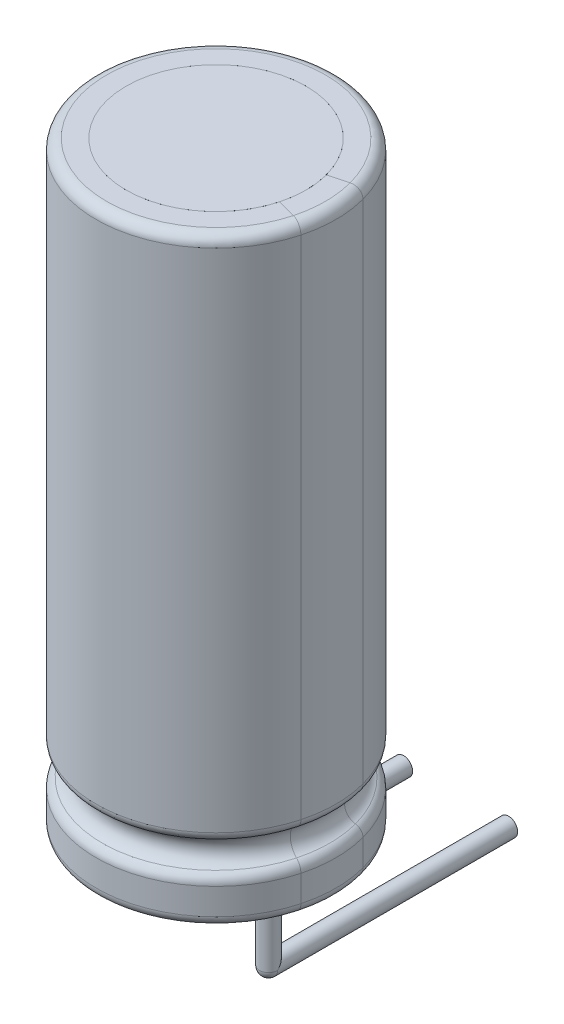
ISO-10303-21;
HEADER;
FILE_DESCRIPTION(('STEP AP214'),'2;1');
FILE_NAME('part.step','',(''),(''),'','','');
FILE_SCHEMA(('AUTOMOTIVE_DESIGN { 1 0 10303 214 1 1 1 1 }'));
ENDSEC;
DATA;
#1=APPLICATION_CONTEXT('core data for automotive mechanical design processes');
#2=APPLICATION_PROTOCOL_DEFINITION('international standard','automotive_design',2000,#1);
#3=PRODUCT_CONTEXT('',#1,'mechanical');
#4=PRODUCT('Part','Part','',(#3));
#5=PRODUCT_RELATED_PRODUCT_CATEGORY('part','',(#4));
#6=PRODUCT_DEFINITION_FORMATION('','',#4);
#7=PRODUCT_DEFINITION_CONTEXT('part definition',#1,'design');
#8=PRODUCT_DEFINITION('design','',#6,#7);
#9=PRODUCT_DEFINITION_SHAPE('','',#8);
#10=(LENGTH_UNIT() NAMED_UNIT(*) SI_UNIT(.MILLI.,.METRE.));
#11=(NAMED_UNIT(*) PLANE_ANGLE_UNIT() SI_UNIT($,.RADIAN.));
#12=(NAMED_UNIT(*) SI_UNIT($,.STERADIAN.) SOLID_ANGLE_UNIT());
#13=UNCERTAINTY_MEASURE_WITH_UNIT(LENGTH_MEASURE(1.E-05),#10,'distance_accuracy_value','');
#14=(GEOMETRIC_REPRESENTATION_CONTEXT(3) GLOBAL_UNCERTAINTY_ASSIGNED_CONTEXT((#13)) GLOBAL_UNIT_ASSIGNED_CONTEXT((#10,
#11,#12)) REPRESENTATION_CONTEXT('',''));
#15=CARTESIAN_POINT('',(0.,0.,0.));
#16=DIRECTION('',(0.,0.,1.));
#17=DIRECTION('',(1.,0.,0.));
#18=AXIS2_PLACEMENT_3D('',#15,#16,#17);
#19=CARTESIAN_POINT('',(-1.75,-3.,0.));
#20=DIRECTION('',(0.,1.,0.));
#21=DIRECTION('',(0.,0.,1.));
#22=AXIS2_PLACEMENT_3D('',#19,#20,#21);
#23=CYLINDRICAL_SURFACE('',#22,0.301076539545515);
#24=CARTESIAN_POINT('',(-1.75,-3.,0.));
#25=DIRECTION('',(0.,-1.,0.));
#26=DIRECTION('',(0.,0.,-1.));
#27=AXIS2_PLACEMENT_3D('',#24,#25,#26);
#28=CIRCLE('',#27,0.301076539545515);
#29=CARTESIAN_POINT('',(-1.44892346045448,-3.,0.));
#30=VERTEX_POINT('',#29);
#31=CARTESIAN_POINT('',(-2.05107653954552,-3.,0.));
#32=VERTEX_POINT('',#31);
#33=EDGE_CURVE('E51',#30,#32,#28,.T.);
#34=ORIENTED_EDGE('',*,*,#33,.F.);
#35=CARTESIAN_POINT('',(-1.75,-3.,0.));
#36=DIRECTION('',(0.,0.707106781186547,0.707106781186547));
#37=DIRECTION('',(0.,0.707106781186547,-0.707106781186547));
#38=AXIS2_PLACEMENT_3D('',#35,#36,#37);
#39=ELLIPSE('',#38,0.425786525537627,0.301076539545515);
#40=EDGE_CURVE('E61',#30,#32,#39,.T.);
#41=ORIENTED_EDGE('',*,*,#40,.T.);
#42=EDGE_LOOP('',(#34,#41));
#43=FACE_BOUND('',#42,.T.);
#44=CARTESIAN_POINT('',(-1.75,0.,0.));
#45=DIRECTION('',(0.,-1.,0.));
#46=DIRECTION('',(0.,0.,-1.));
#47=AXIS2_PLACEMENT_3D('',#44,#45,#46);
#48=CIRCLE('',#47,0.301076539545515);
#49=CARTESIAN_POINT('',(-1.75,0.,-0.301076539545515));
#50=VERTEX_POINT('',#49);
#51=EDGE_CURVE('E12',#50,#50,#48,.T.);
#52=ORIENTED_EDGE('',*,*,#51,.T.);
#53=EDGE_LOOP('',(#52));
#54=FACE_BOUND('',#53,.T.);
#55=ADVANCED_FACE('F47',(#43,#54),#23,.T.);
#56=CARTESIAN_POINT('',(-1.75,0.,0.));
#57=DIRECTION('',(0.,-1.,0.));
#58=DIRECTION('',(0.,0.,-1.));
#59=AXIS2_PLACEMENT_3D('',#56,#57,#58);
#60=PLANE('',#59);
#61=ORIENTED_EDGE('',*,*,#51,.F.);
#62=EDGE_LOOP('',(#61));
#63=FACE_BOUND('',#62,.T.);
#64=ADVANCED_FACE('F49',(#63),#60,.F.);
#65=CARTESIAN_POINT('',(-1.75,-3.,-8.));
#66=DIRECTION('',(0.,0.,1.));
#67=DIRECTION('',(1.,0.,0.));
#68=AXIS2_PLACEMENT_3D('',#65,#66,#67);
#69=CYLINDRICAL_SURFACE('',#68,0.301076539545515);
#70=CARTESIAN_POINT('',(-1.75,-3.,-8.));
#71=DIRECTION('',(0.,0.,1.));
#72=DIRECTION('',(1.,0.,0.));
#73=AXIS2_PLACEMENT_3D('',#70,#71,#72);
#74=CIRCLE('',#73,0.301076539545515);
#75=CARTESIAN_POINT('',(-1.44892346045448,-3.,-8.));
#76=VERTEX_POINT('',#75);
#77=EDGE_CURVE('E72',#76,#76,#74,.T.);
#78=ORIENTED_EDGE('',*,*,#77,.T.);
#79=EDGE_LOOP('',(#78));
#80=FACE_BOUND('',#79,.T.);
#81=ORIENTED_EDGE('',*,*,#40,.F.);
#82=CARTESIAN_POINT('',(-1.75,-3.,0.));
#83=DIRECTION('',(0.,0.,1.));
#84=DIRECTION('',(1.,0.,0.));
#85=AXIS2_PLACEMENT_3D('',#82,#83,#84);
#86=CIRCLE('',#85,0.301076539545515);
#87=EDGE_CURVE('E66',#32,#30,#86,.T.);
#88=ORIENTED_EDGE('',*,*,#87,.F.);
#89=EDGE_LOOP('',(#81,#88));
#90=FACE_BOUND('',#89,.T.);
#91=ADVANCED_FACE('F64',(#80,#90),#69,.T.);
#92=CARTESIAN_POINT('',(-1.75,-3.,-8.));
#93=DIRECTION('',(0.,0.,1.));
#94=DIRECTION('',(1.,0.,0.));
#95=AXIS2_PLACEMENT_3D('',#92,#93,#94);
#96=PLANE('',#95);
#97=ORIENTED_EDGE('',*,*,#77,.F.);
#98=EDGE_LOOP('',(#97));
#99=FACE_BOUND('',#98,.T.);
#100=ADVANCED_FACE('F79',(#99),#96,.F.);
#101=CARTESIAN_POINT('',(-1.75,-3.,0.));
#102=DIRECTION('',(1.,0.,0.));
#103=DIRECTION('',(0.,-1.,0.));
#104=AXIS2_PLACEMENT_3D('',#101,#102,#103);
#105=SPHERICAL_SURFACE('',#104,0.301076539545515);
#106=ORIENTED_EDGE('',*,*,#33,.T.);
#107=ORIENTED_EDGE('',*,*,#87,.T.);
#108=EDGE_LOOP('',(#106,#107));
#109=FACE_BOUND('',#108,.T.);
#110=ADVANCED_FACE('F71',(#109),#105,.T.);
#111=CLOSED_SHELL('',(#55,#64,#91,#100,#110));
#112=MANIFOLD_SOLID_BREP('B2',#111);
#113=CARTESIAN_POINT('',(1.75,-3.,0.));
#114=DIRECTION('',(0.,1.,0.));
#115=DIRECTION('',(0.,0.,1.));
#116=AXIS2_PLACEMENT_3D('',#113,#114,#115);
#117=CYLINDRICAL_SURFACE('',#116,0.303024672407141);
#118=CARTESIAN_POINT('',(1.75,-3.,0.));
#119=DIRECTION('',(0.,-1.,0.));
#120=DIRECTION('',(0.,0.,-1.));
#121=AXIS2_PLACEMENT_3D('',#118,#119,#120);
#122=CIRCLE('',#121,0.303024672407141);
#123=CARTESIAN_POINT('',(2.05302467240714,-3.,0.));
#124=VERTEX_POINT('',#123);
#125=CARTESIAN_POINT('',(1.44697532759286,-3.,0.));
#126=VERTEX_POINT('',#125);
#127=EDGE_CURVE('E45',#124,#126,#122,.T.);
#128=ORIENTED_EDGE('',*,*,#127,.F.);
#129=CARTESIAN_POINT('',(1.75,-3.,0.));
#130=DIRECTION('',(0.,0.707106781186547,0.707106781186547));
#131=DIRECTION('',(0.,0.707106781186547,-0.707106781186547));
#132=AXIS2_PLACEMENT_3D('',#129,#130,#131);
#133=ELLIPSE('',#132,0.428541601451843,0.303024672407141);
#134=EDGE_CURVE('E145',#124,#126,#133,.T.);
#135=ORIENTED_EDGE('',*,*,#134,.T.);
#136=EDGE_LOOP('',(#128,#135));
#137=FACE_BOUND('',#136,.T.);
#138=CARTESIAN_POINT('',(1.75,0.,0.));
#139=DIRECTION('',(0.,-1.,0.));
#140=DIRECTION('',(0.,0.,-1.));
#141=AXIS2_PLACEMENT_3D('',#138,#139,#140);
#142=CIRCLE('',#141,0.303024672407141);
#143=CARTESIAN_POINT('',(1.75,0.,-0.303024672407141));
#144=VERTEX_POINT('',#143);
#145=EDGE_CURVE('E135',#144,#144,#142,.T.);
#146=ORIENTED_EDGE('',*,*,#145,.T.);
#147=EDGE_LOOP('',(#146));
#148=FACE_BOUND('',#147,.T.);
#149=ADVANCED_FACE('F132',(#137,#148),#117,.T.);
#150=CARTESIAN_POINT('',(1.75,0.,0.));
#151=DIRECTION('',(0.,-1.,0.));
#152=DIRECTION('',(0.,0.,-1.));
#153=AXIS2_PLACEMENT_3D('',#150,#151,#152);
#154=PLANE('',#153);
#155=ORIENTED_EDGE('',*,*,#145,.F.);
#156=EDGE_LOOP('',(#155));
#157=FACE_BOUND('',#156,.T.);
#158=ADVANCED_FACE('F170',(#157),#154,.F.);
#159=CARTESIAN_POINT('',(1.75,-3.,-8.));
#160=DIRECTION('',(0.,0.,1.));
#161=DIRECTION('',(1.,0.,0.));
#162=AXIS2_PLACEMENT_3D('',#159,#160,#161);
#163=CYLINDRICAL_SURFACE('',#162,0.303024672407141);
#164=CARTESIAN_POINT('',(1.75,-3.,-8.));
#165=DIRECTION('',(0.,0.,1.));
#166=DIRECTION('',(1.,0.,0.));
#167=AXIS2_PLACEMENT_3D('',#164,#165,#166);
#168=CIRCLE('',#167,0.303024672407141);
#169=CARTESIAN_POINT('',(2.05302467240714,-3.,-8.));
#170=VERTEX_POINT('',#169);
#171=EDGE_CURVE('E151',#170,#170,#168,.T.);
#172=ORIENTED_EDGE('',*,*,#171,.T.);
#173=EDGE_LOOP('',(#172));
#174=FACE_BOUND('',#173,.T.);
#175=ORIENTED_EDGE('',*,*,#134,.F.);
#176=CARTESIAN_POINT('',(1.75,-3.,0.));
#177=DIRECTION('',(0.,0.,1.));
#178=DIRECTION('',(1.,0.,0.));
#179=AXIS2_PLACEMENT_3D('',#176,#177,#178);
#180=CIRCLE('',#179,0.303024672407141);
#181=EDGE_CURVE('E150',#126,#124,#180,.T.);
#182=ORIENTED_EDGE('',*,*,#181,.F.);
#183=EDGE_LOOP('',(#175,#182));
#184=FACE_BOUND('',#183,.T.);
#185=ADVANCED_FACE('F148',(#174,#184),#163,.T.);
#186=CARTESIAN_POINT('',(1.75,-3.,-8.));
#187=DIRECTION('',(0.,0.,1.));
#188=DIRECTION('',(1.,0.,0.));
#189=AXIS2_PLACEMENT_3D('',#186,#187,#188);
#190=PLANE('',#189);
#191=ORIENTED_EDGE('',*,*,#171,.F.);
#192=EDGE_LOOP('',(#191));
#193=FACE_BOUND('',#192,.T.);
#194=ADVANCED_FACE('F162',(#193),#190,.F.);
#195=CARTESIAN_POINT('',(1.75,-3.,0.));
#196=DIRECTION('',(1.,0.,0.));
#197=DIRECTION('',(0.,-1.,0.));
#198=AXIS2_PLACEMENT_3D('',#195,#196,#197);
#199=SPHERICAL_SURFACE('',#198,0.303024672407141);
#200=ORIENTED_EDGE('',*,*,#127,.T.);
#201=ORIENTED_EDGE('',*,*,#181,.T.);
#202=EDGE_LOOP('',(#200,#201));
#203=FACE_BOUND('',#202,.T.);
#204=ADVANCED_FACE('F155',(#203),#199,.T.);
#205=CLOSED_SHELL('',(#149,#158,#185,#194,#204));
#206=MANIFOLD_SOLID_BREP('B6',#205);
#207=CARTESIAN_POINT('',(0.,20.,0.));
#208=DIRECTION('',(0.,-1.,0.));
#209=DIRECTION('',(0.,0.,-1.));
#210=AXIS2_PLACEMENT_3D('',#207,#208,#209);
#211=CYLINDRICAL_SURFACE('',#210,4.);
#212=DIRECTION('',(0.,-1.,0.));
#213=VECTOR('',#212,1.);
#214=CARTESIAN_POINT('',(3.86370330515627,20.,-1.03527618041009));
#215=LINE('',#214,#213);
#216=CARTESIAN_POINT('',(3.86370330515627,1.22540333075851,-1.03527618041009));
#217=VERTEX_POINT('',#216);
#218=CARTESIAN_POINT('',(3.86370330515627,0.35,-1.03527618041009));
#219=VERTEX_POINT('',#218);
#220=EDGE_CURVE('E330',#217,#219,#215,.T.);
#221=ORIENTED_EDGE('',*,*,#220,.T.);
#222=CARTESIAN_POINT('',(0.,0.35,0.));
#223=DIRECTION('',(0.,1.,0.));
#224=DIRECTION('',(0.,0.,1.));
#225=AXIS2_PLACEMENT_3D('',#222,#223,#224);
#226=CIRCLE('',#225,4.);
#227=CARTESIAN_POINT('',(3.86370330515627,0.35,1.03527618041009));
#228=VERTEX_POINT('',#227);
#229=EDGE_CURVE('E336',#219,#228,#226,.T.);
#230=ORIENTED_EDGE('',*,*,#229,.T.);
#231=DIRECTION('',(0.,-1.,0.));
#232=VECTOR('',#231,1.);
#233=CARTESIAN_POINT('',(3.86370330515627,20.,1.03527618041009));
#234=LINE('',#233,#232);
#235=CARTESIAN_POINT('',(3.86370330515627,1.22540333075851,1.03527618041009));
#236=VERTEX_POINT('',#235);
#237=EDGE_CURVE('E326',#236,#228,#234,.T.);
#238=ORIENTED_EDGE('',*,*,#237,.F.);
#239=CARTESIAN_POINT('',(0.,1.22540333075851,0.));
#240=DIRECTION('',(0.,-1.,0.));
#241=DIRECTION('',(0.,0.,-1.));
#242=AXIS2_PLACEMENT_3D('',#239,#240,#241);
#243=CIRCLE('',#242,4.);
#244=EDGE_CURVE('E334',#236,#217,#243,.T.);
#245=ORIENTED_EDGE('',*,*,#244,.T.);
#246=EDGE_LOOP('',(#221,#230,#238,#245));
#247=FACE_BOUND('',#246,.T.);
#248=ADVANCED_FACE('F215',(#247),#211,.T.);
#249=CARTESIAN_POINT('',(3.86370330515627,19.65,-1.03527618041009));
#250=VERTEX_POINT('',#249);
#251=CARTESIAN_POINT('',(3.86370330515627,2.77459666924148,-1.03527618041009));
#252=VERTEX_POINT('',#251);
#253=EDGE_CURVE('E303',#250,#252,#215,.T.);
#254=ORIENTED_EDGE('',*,*,#253,.T.);
#255=CARTESIAN_POINT('',(0.,2.77459666924148,0.));
#256=DIRECTION('',(0.,1.,0.));
#257=DIRECTION('',(0.,0.,1.));
#258=AXIS2_PLACEMENT_3D('',#255,#256,#257);
#259=CIRCLE('',#258,4.);
#260=CARTESIAN_POINT('',(3.86370330515627,2.77459666924148,1.03527618041009));
#261=VERTEX_POINT('',#260);
#262=EDGE_CURVE('E223',#252,#261,#259,.T.);
#263=ORIENTED_EDGE('',*,*,#262,.T.);
#264=CARTESIAN_POINT('',(3.86370330515627,19.65,1.03527618041009));
#265=VERTEX_POINT('',#264);
#266=EDGE_CURVE('E327',#265,#261,#234,.T.);
#267=ORIENTED_EDGE('',*,*,#266,.F.);
#268=CARTESIAN_POINT('',(0.,19.65,0.));
#269=DIRECTION('',(0.,1.,0.));
#270=DIRECTION('',(0.,0.,1.));
#271=AXIS2_PLACEMENT_3D('',#268,#269,#270);
#272=CIRCLE('',#271,4.);
#273=EDGE_CURVE('E361',#265,#250,#272,.F.);
#274=ORIENTED_EDGE('',*,*,#273,.T.);
#275=EDGE_LOOP('',(#254,#263,#267,#274));
#276=FACE_BOUND('',#275,.T.);
#277=ADVANCED_FACE('F365',(#276),#211,.T.);
#278=CARTESIAN_POINT('',(0.,20.,0.));
#279=DIRECTION('',(0.,-1.,0.));
#280=DIRECTION('',(0.,0.,-1.));
#281=AXIS2_PLACEMENT_3D('',#278,#279,#280);
#282=CYLINDRICAL_SURFACE('',#281,3.);
#283=CARTESIAN_POINT('',(0.,0.,0.));
#284=DIRECTION('',(0.,1.,0.));
#285=DIRECTION('',(0.,0.,1.));
#286=AXIS2_PLACEMENT_3D('',#283,#284,#285);
#287=CIRCLE('',#286,3.);
#288=CARTESIAN_POINT('',(2.8977774788672,0.,-0.776457135307564));
#289=VERTEX_POINT('',#288);
#290=CARTESIAN_POINT('',(2.8977774788672,0.,0.776457135307564));
#291=VERTEX_POINT('',#290);
#292=EDGE_CURVE('E299',#289,#291,#287,.T.);
#293=ORIENTED_EDGE('',*,*,#292,.F.);
#294=DIRECTION('',(0.,-1.,0.));
#295=VECTOR('',#294,1.);
#296=CARTESIAN_POINT('',(2.8977774788672,20.,-0.776457135307564));
#297=LINE('',#296,#295);
#298=CARTESIAN_POINT('',(2.8977774788672,20.,-0.776457135307564));
#299=VERTEX_POINT('',#298);
#300=EDGE_CURVE('E293',#299,#289,#297,.T.);
#301=ORIENTED_EDGE('',*,*,#300,.F.);
#302=CARTESIAN_POINT('',(0.,20.,0.));
#303=DIRECTION('',(0.,1.,0.));
#304=DIRECTION('',(0.,0.,1.));
#305=AXIS2_PLACEMENT_3D('',#302,#303,#304);
#306=CIRCLE('',#305,3.);
#307=CARTESIAN_POINT('',(2.8977774788672,20.,0.776457135307564));
#308=VERTEX_POINT('',#307);
#309=EDGE_CURVE('E296',#299,#308,#306,.T.);
#310=ORIENTED_EDGE('',*,*,#309,.T.);
#311=DIRECTION('',(0.,-1.,0.));
#312=VECTOR('',#311,1.);
#313=CARTESIAN_POINT('',(2.8977774788672,20.,0.776457135307564));
#314=LINE('',#313,#312);
#315=EDGE_CURVE('E322',#308,#291,#314,.T.);
#316=ORIENTED_EDGE('',*,*,#315,.T.);
#317=EDGE_LOOP('',(#293,#301,#310,#316));
#318=FACE_BOUND('',#317,.T.);
#319=ADVANCED_FACE('F294',(#318),#282,.F.);
#320=CARTESIAN_POINT('',(0.,20.,0.));
#321=DIRECTION('',(-0.258819045102521,0.,-0.965925826289068));
#322=DIRECTION('',(-0.965925826289068,0.,0.258819045102521));
#323=AXIS2_PLACEMENT_3D('',#320,#321,#322);
#324=PLANE('',#323);
#325=DIRECTION('',(0.965925826289068,0.,-0.258819045102521));
#326=VECTOR('',#325,1.);
#327=CARTESIAN_POINT('',(0.,0.,0.));
#328=LINE('',#327,#326);
#329=CARTESIAN_POINT('',(3.5256292659551,0.,-0.944689514624204));
#330=VERTEX_POINT('',#329);
#331=EDGE_CURVE('E316',#289,#330,#328,.T.);
#332=ORIENTED_EDGE('',*,*,#331,.T.);
#333=CARTESIAN_POINT('',(3.5256292659551,0.35,-0.944689514624203));
#334=DIRECTION('',(-0.258819045102521,0.,-0.965925826289068));
#335=DIRECTION('',(-0.965925826289068,0.,0.258819045102521));
#336=AXIS2_PLACEMENT_3D('',#333,#334,#335);
#337=CIRCLE('',#336,0.35);
#338=EDGE_CURVE('E353',#330,#219,#337,.F.);
#339=ORIENTED_EDGE('',*,*,#338,.T.);
#340=ORIENTED_EDGE('',*,*,#220,.F.);
#341=CARTESIAN_POINT('',(3.5256292659551,1.22540333075851,-0.944689514624203));
#342=DIRECTION('',(-0.258819045102521,0.,-0.965925826289068));
#343=DIRECTION('',(-0.965925826289068,0.,0.258819045102521));
#344=AXIS2_PLACEMENT_3D('',#341,#342,#343);
#345=CIRCLE('',#344,0.35);
#346=CARTESIAN_POINT('',(3.66483622327323,1.54435490044618,-0.98198990641839));
#347=VERTEX_POINT('',#346);
#348=EDGE_CURVE('E351',#217,#347,#345,.F.);
#349=ORIENTED_EDGE('',*,*,#348,.T.);
#350=CARTESIAN_POINT('',(3.86370330515627,2.,-1.03527618041009));
#351=DIRECTION('',(-0.258819045102521,0.,-0.965925826289068));
#352=DIRECTION('',(-0.965925826289068,0.,0.258819045102521));
#353=AXIS2_PLACEMENT_3D('',#350,#351,#352);
#354=CIRCLE('',#353,0.5);
#355=CARTESIAN_POINT('',(3.66483622327323,2.45564509955381,-0.98198990641839));
#356=VERTEX_POINT('',#355);
#357=EDGE_CURVE('E319',#356,#347,#354,.F.);
#358=ORIENTED_EDGE('',*,*,#357,.F.);
#359=CARTESIAN_POINT('',(3.5256292659551,2.77459666924148,-0.944689514624203));
#360=DIRECTION('',(-0.258819045102521,0.,-0.965925826289068));
#361=DIRECTION('',(-0.965925826289068,0.,0.258819045102521));
#362=AXIS2_PLACEMENT_3D('',#359,#360,#361);
#363=CIRCLE('',#362,0.35);
#364=EDGE_CURVE('E236',#356,#252,#363,.F.);
#365=ORIENTED_EDGE('',*,*,#364,.T.);
#366=ORIENTED_EDGE('',*,*,#253,.F.);
#367=CARTESIAN_POINT('',(3.5256292659551,19.65,-0.944689514624203));
#368=DIRECTION('',(-0.258819045102521,0.,-0.965925826289068));
#369=DIRECTION('',(-0.965925826289068,0.,0.258819045102521));
#370=AXIS2_PLACEMENT_3D('',#367,#368,#369);
#371=CIRCLE('',#370,0.35);
#372=CARTESIAN_POINT('',(3.5256292659551,20.,-0.944689514624204));
#373=VERTEX_POINT('',#372);
#374=EDGE_CURVE('E230',#250,#373,#371,.F.);
#375=ORIENTED_EDGE('',*,*,#374,.T.);
#376=DIRECTION('',(0.965925826289068,0.,-0.258819045102521));
#377=VECTOR('',#376,1.);
#378=CARTESIAN_POINT('',(0.,20.,0.));
#379=LINE('',#378,#377);
#380=EDGE_CURVE('E305',#299,#373,#379,.T.);
#381=ORIENTED_EDGE('',*,*,#380,.F.);
#382=ORIENTED_EDGE('',*,*,#300,.T.);
#383=EDGE_LOOP('',(#332,#339,#340,#349,#358,#365,#366,#375,#381,#382));
#384=FACE_BOUND('',#383,.T.);
#385=ADVANCED_FACE('F306',(#384),#324,.F.);
#386=CARTESIAN_POINT('',(0.,20.,0.));
#387=DIRECTION('',(0.258819045102522,0.,-0.965925826289068));
#388=DIRECTION('',(-0.965925826289068,0.,-0.258819045102522));
#389=AXIS2_PLACEMENT_3D('',#386,#387,#388);
#390=PLANE('',#389);
#391=ORIENTED_EDGE('',*,*,#237,.T.);
#392=CARTESIAN_POINT('',(3.5256292659551,0.35,0.944689514624204));
#393=DIRECTION('',(0.258819045102522,0.,-0.965925826289068));
#394=DIRECTION('',(-0.965925826289068,0.,-0.258819045102522));
#395=AXIS2_PLACEMENT_3D('',#392,#393,#394);
#396=CIRCLE('',#395,0.35);
#397=CARTESIAN_POINT('',(3.5256292659551,0.,0.944689514624203));
#398=VERTEX_POINT('',#397);
#399=EDGE_CURVE('E345',#228,#398,#396,.T.);
#400=ORIENTED_EDGE('',*,*,#399,.T.);
#401=DIRECTION('',(0.965925826289068,0.,0.258819045102522));
#402=VECTOR('',#401,1.);
#403=CARTESIAN_POINT('',(0.,0.,0.));
#404=LINE('',#403,#402);
#405=EDGE_CURVE('E313',#291,#398,#404,.T.);
#406=ORIENTED_EDGE('',*,*,#405,.F.);
#407=ORIENTED_EDGE('',*,*,#315,.F.);
#408=DIRECTION('',(0.965925826289068,0.,0.258819045102522));
#409=VECTOR('',#408,1.);
#410=CARTESIAN_POINT('',(0.,20.,0.));
#411=LINE('',#410,#409);
#412=CARTESIAN_POINT('',(3.5256292659551,20.,0.944689514624203));
#413=VERTEX_POINT('',#412);
#414=EDGE_CURVE('E309',#308,#413,#411,.T.);
#415=ORIENTED_EDGE('',*,*,#414,.T.);
#416=CARTESIAN_POINT('',(3.5256292659551,19.65,0.944689514624204));
#417=DIRECTION('',(0.258819045102522,0.,-0.965925826289068));
#418=DIRECTION('',(-0.965925826289068,0.,-0.258819045102522));
#419=AXIS2_PLACEMENT_3D('',#416,#417,#418);
#420=CIRCLE('',#419,0.35);
#421=EDGE_CURVE('E339',#413,#265,#420,.T.);
#422=ORIENTED_EDGE('',*,*,#421,.T.);
#423=ORIENTED_EDGE('',*,*,#266,.T.);
#424=CARTESIAN_POINT('',(3.5256292659551,2.77459666924148,0.944689514624204));
#425=DIRECTION('',(0.258819045102522,0.,-0.965925826289068));
#426=DIRECTION('',(-0.965925826289068,0.,-0.258819045102522));
#427=AXIS2_PLACEMENT_3D('',#424,#425,#426);
#428=CIRCLE('',#427,0.35);
#429=CARTESIAN_POINT('',(3.66483622327323,2.45564509955381,0.981989906418391));
#430=VERTEX_POINT('',#429);
#431=EDGE_CURVE('E341',#261,#430,#428,.T.);
#432=ORIENTED_EDGE('',*,*,#431,.T.);
#433=CARTESIAN_POINT('',(3.86370330515627,2.,1.03527618041009));
#434=DIRECTION('',(0.258819045102522,0.,-0.965925826289068));
#435=DIRECTION('',(-0.965925826289068,0.,-0.258819045102522));
#436=AXIS2_PLACEMENT_3D('',#433,#434,#435);
#437=CIRCLE('',#436,0.5);
#438=CARTESIAN_POINT('',(3.66483622327323,1.54435490044618,0.981989906418391));
#439=VERTEX_POINT('',#438);
#440=EDGE_CURVE('E302',#430,#439,#437,.F.);
#441=ORIENTED_EDGE('',*,*,#440,.T.);
#442=CARTESIAN_POINT('',(3.5256292659551,1.22540333075851,0.944689514624204));
#443=DIRECTION('',(0.258819045102522,0.,-0.965925826289068));
#444=DIRECTION('',(-0.965925826289068,0.,-0.258819045102522));
#445=AXIS2_PLACEMENT_3D('',#442,#443,#444);
#446=CIRCLE('',#445,0.35);
#447=EDGE_CURVE('E343',#439,#236,#446,.T.);
#448=ORIENTED_EDGE('',*,*,#447,.T.);
#449=EDGE_LOOP('',(#391,#400,#406,#407,#415,#422,#423,#432,#441,#448));
#450=FACE_BOUND('',#449,.T.);
#451=ADVANCED_FACE('F371',(#450),#390,.T.);
#452=CARTESIAN_POINT('',(0.,20.,0.));
#453=DIRECTION('',(0.,1.,0.));
#454=DIRECTION('',(0.,0.,1.));
#455=AXIS2_PLACEMENT_3D('',#452,#453,#454);
#456=PLANE('',#455);
#457=ORIENTED_EDGE('',*,*,#380,.T.);
#458=CARTESIAN_POINT('',(0.,20.,0.));
#459=DIRECTION('',(0.,1.,0.));
#460=DIRECTION('',(0.,0.,1.));
#461=AXIS2_PLACEMENT_3D('',#458,#459,#460);
#462=CIRCLE('',#461,3.65);
#463=EDGE_CURVE('E130',#373,#413,#462,.T.);
#464=ORIENTED_EDGE('',*,*,#463,.T.);
#465=ORIENTED_EDGE('',*,*,#414,.F.);
#466=ORIENTED_EDGE('',*,*,#309,.F.);
#467=EDGE_LOOP('',(#457,#464,#465,#466));
#468=FACE_BOUND('',#467,.T.);
#469=ADVANCED_FACE('F311',(#468),#456,.T.);
#470=CARTESIAN_POINT('',(0.,0.,0.));
#471=DIRECTION('',(0.,1.,0.));
#472=DIRECTION('',(0.,0.,1.));
#473=AXIS2_PLACEMENT_3D('',#470,#471,#472);
#474=PLANE('',#473);
#475=ORIENTED_EDGE('',*,*,#405,.T.);
#476=CARTESIAN_POINT('',(0.,0.,0.));
#477=DIRECTION('',(0.,1.,0.));
#478=DIRECTION('',(0.,0.,1.));
#479=AXIS2_PLACEMENT_3D('',#476,#477,#478);
#480=CIRCLE('',#479,3.65);
#481=EDGE_CURVE('E347',#398,#330,#480,.F.);
#482=ORIENTED_EDGE('',*,*,#481,.T.);
#483=ORIENTED_EDGE('',*,*,#331,.F.);
#484=ORIENTED_EDGE('',*,*,#292,.T.);
#485=EDGE_LOOP('',(#475,#482,#483,#484));
#486=FACE_BOUND('',#485,.T.);
#487=ADVANCED_FACE('F394',(#486),#474,.F.);
#488=CARTESIAN_POINT('',(0.,2.,0.));
#489=DIRECTION('',(0.,-1.,0.));
#490=DIRECTION('',(0.,0.,-1.));
#491=AXIS2_PLACEMENT_3D('',#488,#489,#490);
#492=TOROIDAL_SURFACE('',#491,4.,0.5);
#493=ORIENTED_EDGE('',*,*,#357,.T.);
#494=CARTESIAN_POINT('',(0.,1.54435490044618,0.));
#495=DIRECTION('',(0.,1.,0.));
#496=DIRECTION('',(0.,0.,1.));
#497=AXIS2_PLACEMENT_3D('',#494,#495,#496);
#498=CIRCLE('',#497,3.79411764705882);
#499=EDGE_CURVE('E358',#347,#439,#498,.T.);
#500=ORIENTED_EDGE('',*,*,#499,.T.);
#501=ORIENTED_EDGE('',*,*,#440,.F.);
#502=CARTESIAN_POINT('',(0.,2.45564509955382,0.));
#503=DIRECTION('',(0.,-1.,0.));
#504=DIRECTION('',(0.,0.,-1.));
#505=AXIS2_PLACEMENT_3D('',#502,#503,#504);
#506=CIRCLE('',#505,3.79411764705882);
#507=EDGE_CURVE('E355',#430,#356,#506,.T.);
#508=ORIENTED_EDGE('',*,*,#507,.T.);
#509=EDGE_LOOP('',(#493,#500,#501,#508));
#510=FACE_BOUND('',#509,.T.);
#511=ADVANCED_FACE('F377',(#510),#492,.F.);
#512=CARTESIAN_POINT('',(0.,0.35,0.));
#513=DIRECTION('',(0.,1.,0.));
#514=DIRECTION('',(0.,0.,1.));
#515=AXIS2_PLACEMENT_3D('',#512,#513,#514);
#516=TOROIDAL_SURFACE('',#515,3.65,0.35);
#517=ORIENTED_EDGE('',*,*,#338,.F.);
#518=ORIENTED_EDGE('',*,*,#481,.F.);
#519=ORIENTED_EDGE('',*,*,#399,.F.);
#520=ORIENTED_EDGE('',*,*,#229,.F.);
#521=EDGE_LOOP('',(#517,#518,#519,#520));
#522=FACE_BOUND('',#521,.T.);
#523=ADVANCED_FACE('F390',(#522),#516,.T.);
#524=CARTESIAN_POINT('',(0.,1.22540333075851,0.));
#525=DIRECTION('',(0.,-1.,0.));
#526=DIRECTION('',(0.,0.,-1.));
#527=AXIS2_PLACEMENT_3D('',#524,#525,#526);
#528=TOROIDAL_SURFACE('',#527,3.65,0.35);
#529=ORIENTED_EDGE('',*,*,#348,.F.);
#530=ORIENTED_EDGE('',*,*,#244,.F.);
#531=ORIENTED_EDGE('',*,*,#447,.F.);
#532=ORIENTED_EDGE('',*,*,#499,.F.);
#533=EDGE_LOOP('',(#529,#530,#531,#532));
#534=FACE_BOUND('',#533,.T.);
#535=ADVANCED_FACE('F384',(#534),#528,.T.);
#536=CARTESIAN_POINT('',(0.,2.77459666924148,0.));
#537=DIRECTION('',(0.,1.,0.));
#538=DIRECTION('',(0.,0.,1.));
#539=AXIS2_PLACEMENT_3D('',#536,#537,#538);
#540=TOROIDAL_SURFACE('',#539,3.65,0.35);
#541=ORIENTED_EDGE('',*,*,#431,.F.);
#542=ORIENTED_EDGE('',*,*,#262,.F.);
#543=ORIENTED_EDGE('',*,*,#364,.F.);
#544=ORIENTED_EDGE('',*,*,#507,.F.);
#545=EDGE_LOOP('',(#541,#542,#543,#544));
#546=FACE_BOUND('',#545,.T.);
#547=ADVANCED_FACE('F374',(#546),#540,.T.);
#548=CARTESIAN_POINT('',(0.,19.65,0.));
#549=DIRECTION('',(0.,1.,0.));
#550=DIRECTION('',(0.,0.,1.));
#551=AXIS2_PLACEMENT_3D('',#548,#549,#550);
#552=TOROIDAL_SURFACE('',#551,3.65,0.35);
#553=ORIENTED_EDGE('',*,*,#374,.F.);
#554=ORIENTED_EDGE('',*,*,#273,.F.);
#555=ORIENTED_EDGE('',*,*,#421,.F.);
#556=ORIENTED_EDGE('',*,*,#463,.F.);
#557=EDGE_LOOP('',(#553,#554,#555,#556));
#558=FACE_BOUND('',#557,.T.);
#559=ADVANCED_FACE('F217',(#558),#552,.T.);
#560=CLOSED_SHELL('',(#248,#277,#319,#385,#451,#469,#487,#511,#523,#535,#547,#559));
#561=MANIFOLD_SOLID_BREP('B39',#560);
#562=CARTESIAN_POINT('',(0.,20.,0.));
#563=DIRECTION('',(0.,-1.,0.));
#564=DIRECTION('',(0.,0.,-1.));
#565=AXIS2_PLACEMENT_3D('',#562,#563,#564);
#566=CYLINDRICAL_SURFACE('',#565,3.);
#567=CARTESIAN_POINT('',(0.,20.,0.));
#568=DIRECTION('',(0.,1.,0.));
#569=DIRECTION('',(0.,0.,1.));
#570=AXIS2_PLACEMENT_3D('',#567,#568,#569);
#571=CIRCLE('',#570,3.);
#572=CARTESIAN_POINT('',(0.,20.,3.));
#573=VERTEX_POINT('',#572);
#574=EDGE_CURVE('E214',#573,#573,#571,.T.);
#575=ORIENTED_EDGE('',*,*,#574,.F.);
#576=EDGE_LOOP('',(#575));
#577=FACE_BOUND('',#576,.T.);
#578=CARTESIAN_POINT('',(0.,0.,0.));
#579=DIRECTION('',(0.,1.,0.));
#580=DIRECTION('',(0.,0.,1.));
#581=AXIS2_PLACEMENT_3D('',#578,#579,#580);
#582=CIRCLE('',#581,3.);
#583=CARTESIAN_POINT('',(0.,0.,3.));
#584=VERTEX_POINT('',#583);
#585=EDGE_CURVE('E503',#584,#584,#582,.T.);
#586=ORIENTED_EDGE('',*,*,#585,.T.);
#587=EDGE_LOOP('',(#586));
#588=FACE_BOUND('',#587,.T.);
#589=ADVANCED_FACE('F500',(#577,#588),#566,.T.);
#590=CARTESIAN_POINT('',(0.,20.,0.));
#591=DIRECTION('',(0.,1.,0.));
#592=DIRECTION('',(0.,0.,1.));
#593=AXIS2_PLACEMENT_3D('',#590,#591,#592);
#594=PLANE('',#593);
#595=ORIENTED_EDGE('',*,*,#574,.T.);
#596=EDGE_LOOP('',(#595));
#597=FACE_BOUND('',#596,.T.);
#598=ADVANCED_FACE('F515',(#597),#594,.T.);
#599=CARTESIAN_POINT('',(0.,0.,0.));
#600=DIRECTION('',(0.,1.,0.));
#601=DIRECTION('',(0.,0.,1.));
#602=AXIS2_PLACEMENT_3D('',#599,#600,#601);
#603=PLANE('',#602);
#604=ORIENTED_EDGE('',*,*,#585,.F.);
#605=EDGE_LOOP('',(#604));
#606=FACE_BOUND('',#605,.T.);
#607=ADVANCED_FACE('F513',(#606),#603,.F.);
#608=CLOSED_SHELL('',(#589,#598,#607));
#609=MANIFOLD_SOLID_BREP('B124',#608);
#610=CARTESIAN_POINT('',(0.,20.,0.));
#611=DIRECTION('',(0.,-1.,0.));
#612=DIRECTION('',(0.,0.,-1.));
#613=AXIS2_PLACEMENT_3D('',#610,#611,#612);
#614=CYLINDRICAL_SURFACE('',#613,4.);
#615=DIRECTION('',(0.,-1.,0.));
#616=VECTOR('',#615,1.);
#617=CARTESIAN_POINT('',(3.86370330515627,20.,1.03527618041009));
#618=LINE('',#617,#616);
#619=CARTESIAN_POINT('',(3.86370330515627,1.22540333075851,1.03527618041009));
#620=VERTEX_POINT('',#619);
#621=CARTESIAN_POINT('',(3.86370330515627,0.35,1.03527618041009));
#622=VERTEX_POINT('',#621);
#623=EDGE_CURVE('E655',#620,#622,#618,.T.);
#624=ORIENTED_EDGE('',*,*,#623,.T.);
#625=CARTESIAN_POINT('',(0.,0.35,0.));
#626=DIRECTION('',(0.,1.,0.));
#627=DIRECTION('',(0.,0.,1.));
#628=AXIS2_PLACEMENT_3D('',#625,#626,#627);
#629=CIRCLE('',#628,4.);
#630=CARTESIAN_POINT('',(3.86370330515627,0.35,-1.03527618041009));
#631=VERTEX_POINT('',#630);
#632=EDGE_CURVE('E661',#622,#631,#629,.T.);
#633=ORIENTED_EDGE('',*,*,#632,.T.);
#634=DIRECTION('',(0.,-1.,0.));
#635=VECTOR('',#634,1.);
#636=CARTESIAN_POINT('',(3.86370330515627,20.,-1.03527618041009));
#637=LINE('',#636,#635);
#638=CARTESIAN_POINT('',(3.86370330515627,1.22540333075851,-1.03527618041009));
#639=VERTEX_POINT('',#638);
#640=EDGE_CURVE('E651',#639,#631,#637,.T.);
#641=ORIENTED_EDGE('',*,*,#640,.F.);
#642=CARTESIAN_POINT('',(0.,1.22540333075851,0.));
#643=DIRECTION('',(0.,-1.,0.));
#644=DIRECTION('',(0.,0.,-1.));
#645=AXIS2_PLACEMENT_3D('',#642,#643,#644);
#646=CIRCLE('',#645,4.);
#647=EDGE_CURVE('E659',#639,#620,#646,.T.);
#648=ORIENTED_EDGE('',*,*,#647,.T.);
#649=EDGE_LOOP('',(#624,#633,#641,#648));
#650=FACE_BOUND('',#649,.T.);
#651=ADVANCED_FACE('F540',(#650),#614,.T.);
#652=CARTESIAN_POINT('',(3.86370330515627,19.65,1.03527618041009));
#653=VERTEX_POINT('',#652);
#654=CARTESIAN_POINT('',(3.86370330515627,2.77459666924148,1.03527618041009));
#655=VERTEX_POINT('',#654);
#656=EDGE_CURVE('E628',#653,#655,#618,.T.);
#657=ORIENTED_EDGE('',*,*,#656,.T.);
#658=CARTESIAN_POINT('',(0.,2.77459666924148,0.));
#659=DIRECTION('',(0.,1.,0.));
#660=DIRECTION('',(0.,0.,1.));
#661=AXIS2_PLACEMENT_3D('',#658,#659,#660);
#662=CIRCLE('',#661,4.);
#663=CARTESIAN_POINT('',(3.86370330515627,2.77459666924148,-1.03527618041009));
#664=VERTEX_POINT('',#663);
#665=EDGE_CURVE('E548',#655,#664,#662,.T.);
#666=ORIENTED_EDGE('',*,*,#665,.T.);
#667=CARTESIAN_POINT('',(3.86370330515627,19.65,-1.03527618041009));
#668=VERTEX_POINT('',#667);
#669=EDGE_CURVE('E652',#668,#664,#637,.T.);
#670=ORIENTED_EDGE('',*,*,#669,.F.);
#671=CARTESIAN_POINT('',(0.,19.65,0.));
#672=DIRECTION('',(0.,1.,0.));
#673=DIRECTION('',(0.,0.,1.));
#674=AXIS2_PLACEMENT_3D('',#671,#672,#673);
#675=CIRCLE('',#674,4.);
#676=EDGE_CURVE('E686',#668,#653,#675,.F.);
#677=ORIENTED_EDGE('',*,*,#676,.T.);
#678=EDGE_LOOP('',(#657,#666,#670,#677));
#679=FACE_BOUND('',#678,.T.);
#680=ADVANCED_FACE('F690',(#679),#614,.T.);
#681=CARTESIAN_POINT('',(0.,20.,0.));
#682=DIRECTION('',(0.,-1.,0.));
#683=DIRECTION('',(0.,0.,-1.));
#684=AXIS2_PLACEMENT_3D('',#681,#682,#683);
#685=CYLINDRICAL_SURFACE('',#684,3.);
#686=CARTESIAN_POINT('',(0.,0.,0.));
#687=DIRECTION('',(0.,1.,0.));
#688=DIRECTION('',(0.,0.,1.));
#689=AXIS2_PLACEMENT_3D('',#686,#687,#688);
#690=CIRCLE('',#689,3.);
#691=CARTESIAN_POINT('',(2.8977774788672,0.,0.776457135307564));
#692=VERTEX_POINT('',#691);
#693=CARTESIAN_POINT('',(2.8977774788672,0.,-0.776457135307564));
#694=VERTEX_POINT('',#693);
#695=EDGE_CURVE('E624',#692,#694,#690,.T.);
#696=ORIENTED_EDGE('',*,*,#695,.F.);
#697=DIRECTION('',(0.,-1.,0.));
#698=VECTOR('',#697,1.);
#699=CARTESIAN_POINT('',(2.8977774788672,20.,0.776457135307564));
#700=LINE('',#699,#698);
#701=CARTESIAN_POINT('',(2.8977774788672,20.,0.776457135307564));
#702=VERTEX_POINT('',#701);
#703=EDGE_CURVE('E618',#702,#692,#700,.T.);
#704=ORIENTED_EDGE('',*,*,#703,.F.);
#705=CARTESIAN_POINT('',(0.,20.,0.));
#706=DIRECTION('',(0.,1.,0.));
#707=DIRECTION('',(0.,0.,1.));
#708=AXIS2_PLACEMENT_3D('',#705,#706,#707);
#709=CIRCLE('',#708,3.);
#710=CARTESIAN_POINT('',(2.8977774788672,20.,-0.776457135307564));
#711=VERTEX_POINT('',#710);
#712=EDGE_CURVE('E621',#702,#711,#709,.T.);
#713=ORIENTED_EDGE('',*,*,#712,.T.);
#714=DIRECTION('',(0.,-1.,0.));
#715=VECTOR('',#714,1.);
#716=CARTESIAN_POINT('',(2.8977774788672,20.,-0.776457135307564));
#717=LINE('',#716,#715);
#718=EDGE_CURVE('E647',#711,#694,#717,.T.);
#719=ORIENTED_EDGE('',*,*,#718,.T.);
#720=EDGE_LOOP('',(#696,#704,#713,#719));
#721=FACE_BOUND('',#720,.T.);
#722=ADVANCED_FACE('F619',(#721),#685,.F.);
#723=CARTESIAN_POINT('',(0.,20.,0.));
#724=DIRECTION('',(0.258819045102522,0.,-0.965925826289068));
#725=DIRECTION('',(-0.965925826289068,0.,-0.258819045102522));
#726=AXIS2_PLACEMENT_3D('',#723,#724,#725);
#727=PLANE('',#726);
#728=DIRECTION('',(0.965925826289068,0.,0.258819045102522));
#729=VECTOR('',#728,1.);
#730=CARTESIAN_POINT('',(0.,0.,0.));
#731=LINE('',#730,#729);
#732=CARTESIAN_POINT('',(3.5256292659551,0.,0.944689514624203));
#733=VERTEX_POINT('',#732);
#734=EDGE_CURVE('E641',#692,#733,#731,.T.);
#735=ORIENTED_EDGE('',*,*,#734,.T.);
#736=CARTESIAN_POINT('',(3.5256292659551,0.35,0.944689514624204));
#737=DIRECTION('',(0.258819045102522,0.,-0.965925826289068));
#738=DIRECTION('',(-0.965925826289068,0.,-0.258819045102522));
#739=AXIS2_PLACEMENT_3D('',#736,#737,#738);
#740=CIRCLE('',#739,0.35);
#741=EDGE_CURVE('E678',#733,#622,#740,.F.);
#742=ORIENTED_EDGE('',*,*,#741,.T.);
#743=ORIENTED_EDGE('',*,*,#623,.F.);
#744=CARTESIAN_POINT('',(3.5256292659551,1.22540333075851,0.944689514624204));
#745=DIRECTION('',(0.258819045102522,0.,-0.965925826289068));
#746=DIRECTION('',(-0.965925826289068,0.,-0.258819045102522));
#747=AXIS2_PLACEMENT_3D('',#744,#745,#746);
#748=CIRCLE('',#747,0.35);
#749=CARTESIAN_POINT('',(3.66483622327323,1.54435490044618,0.98198990641839));
#750=VERTEX_POINT('',#749);
#751=EDGE_CURVE('E676',#620,#750,#748,.F.);
#752=ORIENTED_EDGE('',*,*,#751,.T.);
#753=CARTESIAN_POINT('',(3.86370330515627,2.,1.03527618041009));
#754=DIRECTION('',(0.258819045102522,0.,-0.965925826289068));
#755=DIRECTION('',(-0.965925826289068,0.,-0.258819045102522));
#756=AXIS2_PLACEMENT_3D('',#753,#754,#755);
#757=CIRCLE('',#756,0.5);
#758=CARTESIAN_POINT('',(3.66483622327323,2.45564509955381,0.981989906418391));
#759=VERTEX_POINT('',#758);
#760=EDGE_CURVE('E644',#759,#750,#757,.F.);
#761=ORIENTED_EDGE('',*,*,#760,.F.);
#762=CARTESIAN_POINT('',(3.5256292659551,2.77459666924148,0.944689514624204));
#763=DIRECTION('',(0.258819045102522,0.,-0.965925826289068));
#764=DIRECTION('',(-0.965925826289068,0.,-0.258819045102522));
#765=AXIS2_PLACEMENT_3D('',#762,#763,#764);
#766=CIRCLE('',#765,0.35);
#767=EDGE_CURVE('E561',#759,#655,#766,.F.);
#768=ORIENTED_EDGE('',*,*,#767,.T.);
#769=ORIENTED_EDGE('',*,*,#656,.F.);
#770=CARTESIAN_POINT('',(3.5256292659551,19.65,0.944689514624204));
#771=DIRECTION('',(0.258819045102522,0.,-0.965925826289068));
#772=DIRECTION('',(-0.965925826289068,0.,-0.258819045102522));
#773=AXIS2_PLACEMENT_3D('',#770,#771,#772);
#774=CIRCLE('',#773,0.35);
#775=CARTESIAN_POINT('',(3.5256292659551,20.,0.944689514624203));
#776=VERTEX_POINT('',#775);
#777=EDGE_CURVE('E555',#653,#776,#774,.F.);
#778=ORIENTED_EDGE('',*,*,#777,.T.);
#779=DIRECTION('',(0.965925826289068,0.,0.258819045102522));
#780=VECTOR('',#779,1.);
#781=CARTESIAN_POINT('',(0.,20.,0.));
#782=LINE('',#781,#780);
#783=EDGE_CURVE('E630',#702,#776,#782,.T.);
#784=ORIENTED_EDGE('',*,*,#783,.F.);
#785=ORIENTED_EDGE('',*,*,#703,.T.);
#786=EDGE_LOOP('',(#735,#742,#743,#752,#761,#768,#769,#778,#784,#785));
#787=FACE_BOUND('',#786,.T.);
#788=ADVANCED_FACE('F631',(#787),#727,.F.);
#789=CARTESIAN_POINT('',(0.,20.,0.));
#790=DIRECTION('',(-0.258819045102521,0.,-0.965925826289068));
#791=DIRECTION('',(-0.965925826289068,0.,0.258819045102521));
#792=AXIS2_PLACEMENT_3D('',#789,#790,#791);
#793=PLANE('',#792);
#794=ORIENTED_EDGE('',*,*,#640,.T.);
#795=CARTESIAN_POINT('',(3.5256292659551,0.35,-0.944689514624203));
#796=DIRECTION('',(-0.258819045102521,0.,-0.965925826289068));
#797=DIRECTION('',(-0.965925826289068,0.,0.258819045102521));
#798=AXIS2_PLACEMENT_3D('',#795,#796,#797);
#799=CIRCLE('',#798,0.35);
#800=CARTESIAN_POINT('',(3.5256292659551,0.,-0.944689514624204));
#801=VERTEX_POINT('',#800);
#802=EDGE_CURVE('E670',#631,#801,#799,.T.);
#803=ORIENTED_EDGE('',*,*,#802,.T.);
#804=DIRECTION('',(0.965925826289068,0.,-0.258819045102521));
#805=VECTOR('',#804,1.);
#806=CARTESIAN_POINT('',(0.,0.,0.));
#807=LINE('',#806,#805);
#808=EDGE_CURVE('E638',#694,#801,#807,.T.);
#809=ORIENTED_EDGE('',*,*,#808,.F.);
#810=ORIENTED_EDGE('',*,*,#718,.F.);
#811=DIRECTION('',(0.965925826289068,0.,-0.258819045102521));
#812=VECTOR('',#811,1.);
#813=CARTESIAN_POINT('',(0.,20.,0.));
#814=LINE('',#813,#812);
#815=CARTESIAN_POINT('',(3.5256292659551,20.,-0.944689514624204));
#816=VERTEX_POINT('',#815);
#817=EDGE_CURVE('E634',#711,#816,#814,.T.);
#818=ORIENTED_EDGE('',*,*,#817,.T.);
#819=CARTESIAN_POINT('',(3.5256292659551,19.65,-0.944689514624203));
#820=DIRECTION('',(-0.258819045102521,0.,-0.965925826289068));
#821=DIRECTION('',(-0.965925826289068,0.,0.258819045102521));
#822=AXIS2_PLACEMENT_3D('',#819,#820,#821);
#823=CIRCLE('',#822,0.35);
#824=EDGE_CURVE('E664',#816,#668,#823,.T.);
#825=ORIENTED_EDGE('',*,*,#824,.T.);
#826=ORIENTED_EDGE('',*,*,#669,.T.);
#827=CARTESIAN_POINT('',(3.5256292659551,2.77459666924148,-0.944689514624203));
#828=DIRECTION('',(-0.258819045102521,0.,-0.965925826289068));
#829=DIRECTION('',(-0.965925826289068,0.,0.258819045102521));
#830=AXIS2_PLACEMENT_3D('',#827,#828,#829);
#831=CIRCLE('',#830,0.35);
#832=CARTESIAN_POINT('',(3.66483622327323,2.45564509955381,-0.98198990641839));
#833=VERTEX_POINT('',#832);
#834=EDGE_CURVE('E666',#664,#833,#831,.T.);
#835=ORIENTED_EDGE('',*,*,#834,.T.);
#836=CARTESIAN_POINT('',(3.86370330515627,2.,-1.03527618041009));
#837=DIRECTION('',(-0.258819045102521,0.,-0.965925826289068));
#838=DIRECTION('',(-0.965925826289068,0.,0.258819045102521));
#839=AXIS2_PLACEMENT_3D('',#836,#837,#838);
#840=CIRCLE('',#839,0.5);
#841=CARTESIAN_POINT('',(3.66483622327323,1.54435490044618,-0.98198990641839));
#842=VERTEX_POINT('',#841);
#843=EDGE_CURVE('E627',#833,#842,#840,.F.);
#844=ORIENTED_EDGE('',*,*,#843,.T.);
#845=CARTESIAN_POINT('',(3.5256292659551,1.22540333075851,-0.944689514624203));
#846=DIRECTION('',(-0.258819045102521,0.,-0.965925826289068));
#847=DIRECTION('',(-0.965925826289068,0.,0.258819045102521));
#848=AXIS2_PLACEMENT_3D('',#845,#846,#847);
#849=CIRCLE('',#848,0.35);
#850=EDGE_CURVE('E668',#842,#639,#849,.T.);
#851=ORIENTED_EDGE('',*,*,#850,.T.);
#852=EDGE_LOOP('',(#794,#803,#809,#810,#818,#825,#826,#835,#844,#851));
#853=FACE_BOUND('',#852,.T.);
#854=ADVANCED_FACE('F696',(#853),#793,.T.);
#855=CARTESIAN_POINT('',(0.,20.,0.));
#856=DIRECTION('',(0.,1.,0.));
#857=DIRECTION('',(0.,0.,1.));
#858=AXIS2_PLACEMENT_3D('',#855,#856,#857);
#859=PLANE('',#858);
#860=ORIENTED_EDGE('',*,*,#783,.T.);
#861=CARTESIAN_POINT('',(0.,20.,0.));
#862=DIRECTION('',(0.,1.,0.));
#863=DIRECTION('',(0.,0.,1.));
#864=AXIS2_PLACEMENT_3D('',#861,#862,#863);
#865=CIRCLE('',#864,3.65);
#866=EDGE_CURVE('E498',#776,#816,#865,.T.);
#867=ORIENTED_EDGE('',*,*,#866,.T.);
#868=ORIENTED_EDGE('',*,*,#817,.F.);
#869=ORIENTED_EDGE('',*,*,#712,.F.);
#870=EDGE_LOOP('',(#860,#867,#868,#869));
#871=FACE_BOUND('',#870,.T.);
#872=ADVANCED_FACE('F636',(#871),#859,.T.);
#873=CARTESIAN_POINT('',(0.,0.,0.));
#874=DIRECTION('',(0.,1.,0.));
#875=DIRECTION('',(0.,0.,1.));
#876=AXIS2_PLACEMENT_3D('',#873,#874,#875);
#877=PLANE('',#876);
#878=ORIENTED_EDGE('',*,*,#808,.T.);
#879=CARTESIAN_POINT('',(0.,0.,0.));
#880=DIRECTION('',(0.,1.,0.));
#881=DIRECTION('',(0.,0.,1.));
#882=AXIS2_PLACEMENT_3D('',#879,#880,#881);
#883=CIRCLE('',#882,3.65);
#884=EDGE_CURVE('E672',#801,#733,#883,.F.);
#885=ORIENTED_EDGE('',*,*,#884,.T.);
#886=ORIENTED_EDGE('',*,*,#734,.F.);
#887=ORIENTED_EDGE('',*,*,#695,.T.);
#888=EDGE_LOOP('',(#878,#885,#886,#887));
#889=FACE_BOUND('',#888,.T.);
#890=ADVANCED_FACE('F719',(#889),#877,.F.);
#891=CARTESIAN_POINT('',(0.,2.,0.));
#892=DIRECTION('',(0.,-1.,0.));
#893=DIRECTION('',(0.,0.,-1.));
#894=AXIS2_PLACEMENT_3D('',#891,#892,#893);
#895=TOROIDAL_SURFACE('',#894,4.,0.5);
#896=ORIENTED_EDGE('',*,*,#760,.T.);
#897=CARTESIAN_POINT('',(0.,1.54435490044616,0.));
#898=DIRECTION('',(0.,1.,0.));
#899=DIRECTION('',(0.,0.,1.));
#900=AXIS2_PLACEMENT_3D('',#897,#898,#899);
#901=CIRCLE('',#900,3.79411764705881);
#902=EDGE_CURVE('E683',#750,#842,#901,.T.);
#903=ORIENTED_EDGE('',*,*,#902,.T.);
#904=ORIENTED_EDGE('',*,*,#843,.F.);
#905=CARTESIAN_POINT('',(0.,2.45564509955382,0.));
#906=DIRECTION('',(0.,-1.,0.));
#907=DIRECTION('',(0.,0.,-1.));
#908=AXIS2_PLACEMENT_3D('',#905,#906,#907);
#909=CIRCLE('',#908,3.79411764705882);
#910=EDGE_CURVE('E680',#833,#759,#909,.T.);
#911=ORIENTED_EDGE('',*,*,#910,.T.);
#912=EDGE_LOOP('',(#896,#903,#904,#911));
#913=FACE_BOUND('',#912,.T.);
#914=ADVANCED_FACE('F702',(#913),#895,.F.);
#915=CARTESIAN_POINT('',(0.,0.35,0.));
#916=DIRECTION('',(0.,1.,0.));
#917=DIRECTION('',(0.,0.,1.));
#918=AXIS2_PLACEMENT_3D('',#915,#916,#917);
#919=TOROIDAL_SURFACE('',#918,3.65,0.35);
#920=ORIENTED_EDGE('',*,*,#741,.F.);
#921=ORIENTED_EDGE('',*,*,#884,.F.);
#922=ORIENTED_EDGE('',*,*,#802,.F.);
#923=ORIENTED_EDGE('',*,*,#632,.F.);
#924=EDGE_LOOP('',(#920,#921,#922,#923));
#925=FACE_BOUND('',#924,.T.);
#926=ADVANCED_FACE('F715',(#925),#919,.T.);
#927=CARTESIAN_POINT('',(0.,1.22540333075851,0.));
#928=DIRECTION('',(0.,-1.,0.));
#929=DIRECTION('',(0.,0.,-1.));
#930=AXIS2_PLACEMENT_3D('',#927,#928,#929);
#931=TOROIDAL_SURFACE('',#930,3.65,0.35);
#932=ORIENTED_EDGE('',*,*,#751,.F.);
#933=ORIENTED_EDGE('',*,*,#647,.F.);
#934=ORIENTED_EDGE('',*,*,#850,.F.);
#935=ORIENTED_EDGE('',*,*,#902,.F.);
#936=EDGE_LOOP('',(#932,#933,#934,#935));
#937=FACE_BOUND('',#936,.T.);
#938=ADVANCED_FACE('F709',(#937),#931,.T.);
#939=CARTESIAN_POINT('',(0.,2.77459666924148,0.));
#940=DIRECTION('',(0.,1.,0.));
#941=DIRECTION('',(0.,0.,1.));
#942=AXIS2_PLACEMENT_3D('',#939,#940,#941);
#943=TOROIDAL_SURFACE('',#942,3.65,0.35);
#944=ORIENTED_EDGE('',*,*,#834,.F.);
#945=ORIENTED_EDGE('',*,*,#665,.F.);
#946=ORIENTED_EDGE('',*,*,#767,.F.);
#947=ORIENTED_EDGE('',*,*,#910,.F.);
#948=EDGE_LOOP('',(#944,#945,#946,#947));
#949=FACE_BOUND('',#948,.T.);
#950=ADVANCED_FACE('F699',(#949),#943,.T.);
#951=CARTESIAN_POINT('',(0.,19.65,0.));
#952=DIRECTION('',(0.,1.,0.));
#953=DIRECTION('',(0.,0.,1.));
#954=AXIS2_PLACEMENT_3D('',#951,#952,#953);
#955=TOROIDAL_SURFACE('',#954,3.65,0.35);
#956=ORIENTED_EDGE('',*,*,#777,.F.);
#957=ORIENTED_EDGE('',*,*,#676,.F.);
#958=ORIENTED_EDGE('',*,*,#824,.F.);
#959=ORIENTED_EDGE('',*,*,#866,.F.);
#960=EDGE_LOOP('',(#956,#957,#958,#959));
#961=FACE_BOUND('',#960,.T.);
#962=ADVANCED_FACE('F542',(#961),#955,.T.);
#963=CLOSED_SHELL('',(#651,#680,#722,#788,#854,#872,#890,#914,#926,#938,#950,#962));
#964=MANIFOLD_SOLID_BREP('B209',#963);
#965=ADVANCED_BREP_SHAPE_REPRESENTATION('',(#18,#112,#206,#561,#609,#964),#14);
#966=SHAPE_DEFINITION_REPRESENTATION(#9,#965);
ENDSEC;
END-ISO-10303-21;
